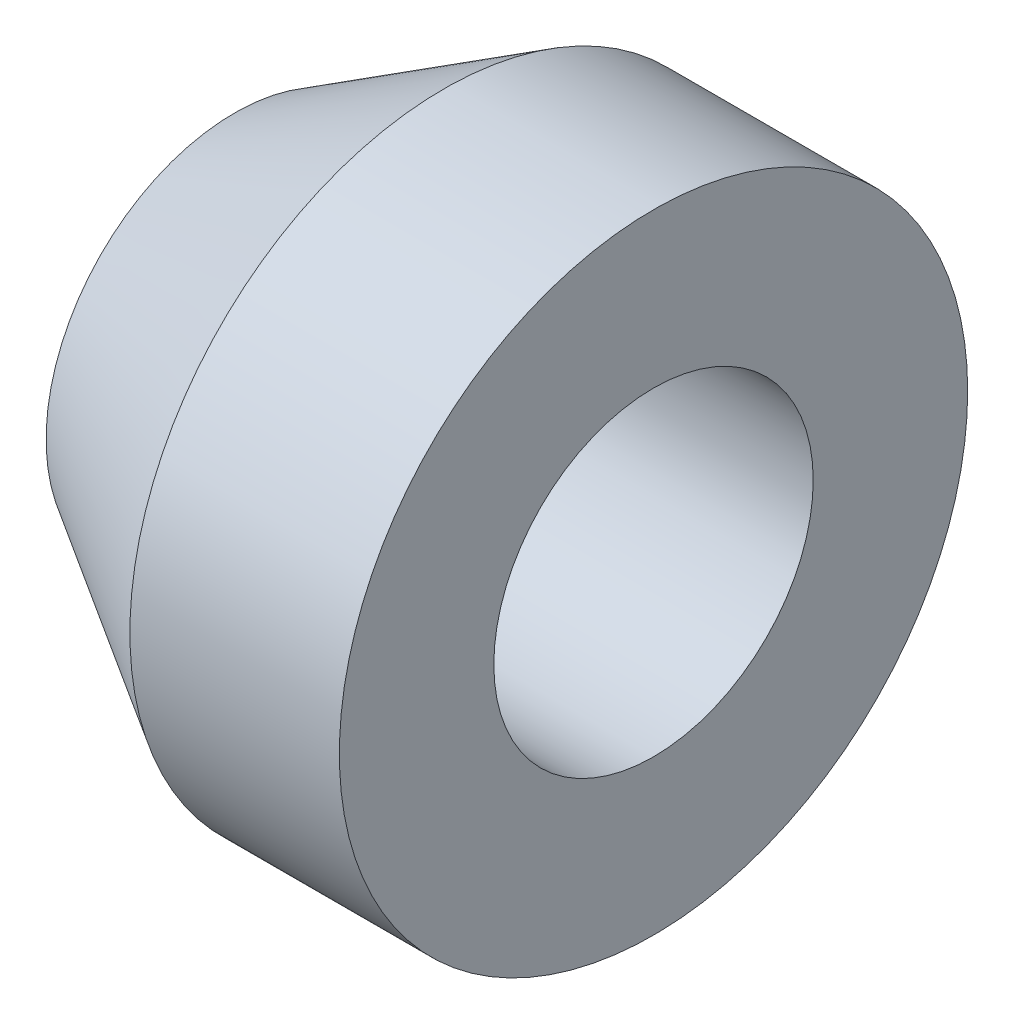
ISO-10303-21;
HEADER;
FILE_DESCRIPTION(('STEP AP214'),'2;1');
FILE_NAME('part.step','',(''),(''),'','','');
FILE_SCHEMA(('AUTOMOTIVE_DESIGN { 1 0 10303 214 1 1 1 1 }'));
ENDSEC;
DATA;
#1=APPLICATION_CONTEXT('core data for automotive mechanical design processes');
#2=APPLICATION_PROTOCOL_DEFINITION('international standard','automotive_design',2000,#1);
#3=PRODUCT_CONTEXT('',#1,'mechanical');
#4=PRODUCT('Part','Part','',(#3));
#5=PRODUCT_RELATED_PRODUCT_CATEGORY('part','',(#4));
#6=PRODUCT_DEFINITION_FORMATION('','',#4);
#7=PRODUCT_DEFINITION_CONTEXT('part definition',#1,'design');
#8=PRODUCT_DEFINITION('design','',#6,#7);
#9=PRODUCT_DEFINITION_SHAPE('','',#8);
#10=(LENGTH_UNIT() NAMED_UNIT(*) SI_UNIT(.MILLI.,.METRE.));
#11=(NAMED_UNIT(*) PLANE_ANGLE_UNIT() SI_UNIT($,.RADIAN.));
#12=(NAMED_UNIT(*) SI_UNIT($,.STERADIAN.) SOLID_ANGLE_UNIT());
#13=UNCERTAINTY_MEASURE_WITH_UNIT(LENGTH_MEASURE(1.E-05),#10,'distance_accuracy_value','');
#14=(GEOMETRIC_REPRESENTATION_CONTEXT(3) GLOBAL_UNCERTAINTY_ASSIGNED_CONTEXT((#13)) GLOBAL_UNIT_ASSIGNED_CONTEXT((#10,
#11,#12)) REPRESENTATION_CONTEXT('',''));
#15=CARTESIAN_POINT('',(0.,0.,0.));
#16=DIRECTION('',(0.,0.,1.));
#17=DIRECTION('',(1.,0.,0.));
#18=AXIS2_PLACEMENT_3D('',#15,#16,#17);
#19=CARTESIAN_POINT('',(4.,0.,0.));
#20=DIRECTION('',(1.,0.,0.));
#21=DIRECTION('',(0.,0.,-1.));
#22=AXIS2_PLACEMENT_3D('',#19,#20,#21);
#23=PLANE('',#22);
#24=CARTESIAN_POINT('',(4.,0.,0.));
#25=DIRECTION('',(1.,0.,0.));
#26=DIRECTION('',(0.,0.,-1.));
#27=AXIS2_PLACEMENT_3D('',#24,#25,#26);
#28=CIRCLE('',#27,3.);
#29=CARTESIAN_POINT('',(4.,0.,-3.));
#30=VERTEX_POINT('',#29);
#31=EDGE_CURVE('E41',#30,#30,#28,.T.);
#32=ORIENTED_EDGE('',*,*,#31,.T.);
#33=EDGE_LOOP('',(#32));
#34=FACE_BOUND('',#33,.T.);
#35=CARTESIAN_POINT('',(4.,0.,0.));
#36=DIRECTION('',(1.,0.,0.));
#37=DIRECTION('',(0.,0.,-1.));
#38=AXIS2_PLACEMENT_3D('',#35,#36,#37);
#39=CIRCLE('',#38,1.525);
#40=CARTESIAN_POINT('',(4.,0.,-1.525));
#41=VERTEX_POINT('',#40);
#42=EDGE_CURVE('E45',#41,#41,#39,.T.);
#43=ORIENTED_EDGE('',*,*,#42,.F.);
#44=EDGE_LOOP('',(#43));
#45=FACE_BOUND('',#44,.T.);
#46=ADVANCED_FACE('F30',(#34,#45),#23,.T.);
#47=CARTESIAN_POINT('',(0.,0.,0.));
#48=DIRECTION('',(1.,0.,0.));
#49=DIRECTION('',(0.,0.,-1.));
#50=AXIS2_PLACEMENT_3D('',#47,#48,#49);
#51=PLANE('',#50);
#52=CARTESIAN_POINT('',(0.,0.,0.));
#53=DIRECTION('',(1.,0.,0.));
#54=DIRECTION('',(0.,0.,-1.));
#55=AXIS2_PLACEMENT_3D('',#52,#53,#54);
#56=CIRCLE('',#55,1.8);
#57=CARTESIAN_POINT('',(0.,0.,-1.8));
#58=VERTEX_POINT('',#57);
#59=EDGE_CURVE('E10',#58,#58,#56,.F.);
#60=ORIENTED_EDGE('',*,*,#59,.T.);
#61=EDGE_LOOP('',(#60));
#62=FACE_BOUND('',#61,.T.);
#63=CARTESIAN_POINT('',(0.,0.,0.));
#64=DIRECTION('',(1.,0.,0.));
#65=DIRECTION('',(0.,0.,-1.));
#66=AXIS2_PLACEMENT_3D('',#63,#64,#65);
#67=CIRCLE('',#66,1.525);
#68=CARTESIAN_POINT('',(0.,0.,-1.525));
#69=VERTEX_POINT('',#68);
#70=EDGE_CURVE('E48',#69,#69,#67,.T.);
#71=ORIENTED_EDGE('',*,*,#70,.T.);
#72=EDGE_LOOP('',(#71));
#73=FACE_BOUND('',#72,.T.);
#74=ADVANCED_FACE('F58',(#62,#73),#51,.F.);
#75=CARTESIAN_POINT('',(4.,0.,0.));
#76=DIRECTION('',(-1.,0.,0.));
#77=DIRECTION('',(0.,0.,1.));
#78=AXIS2_PLACEMENT_3D('',#75,#76,#77);
#79=CYLINDRICAL_SURFACE('',#78,3.);
#80=CARTESIAN_POINT('',(2.00000000000001,0.,0.));
#81=DIRECTION('',(1.,0.,0.));
#82=DIRECTION('',(0.,0.,-1.));
#83=AXIS2_PLACEMENT_3D('',#80,#81,#82);
#84=CIRCLE('',#83,3.);
#85=CARTESIAN_POINT('',(2.00000000000001,0.,-3.));
#86=VERTEX_POINT('',#85);
#87=EDGE_CURVE('E37',#86,#86,#84,.T.);
#88=ORIENTED_EDGE('',*,*,#87,.T.);
#89=EDGE_LOOP('',(#88));
#90=FACE_BOUND('',#89,.T.);
#91=ORIENTED_EDGE('',*,*,#31,.F.);
#92=EDGE_LOOP('',(#91));
#93=FACE_BOUND('',#92,.T.);
#94=ADVANCED_FACE('F64',(#90,#93),#79,.T.);
#95=CARTESIAN_POINT('',(4.,0.,0.));
#96=DIRECTION('',(-1.,0.,0.));
#97=DIRECTION('',(0.,0.,1.));
#98=AXIS2_PLACEMENT_3D('',#95,#96,#97);
#99=CYLINDRICAL_SURFACE('',#98,1.525);
#100=ORIENTED_EDGE('',*,*,#42,.T.);
#101=EDGE_LOOP('',(#100));
#102=FACE_BOUND('',#101,.T.);
#103=ORIENTED_EDGE('',*,*,#70,.F.);
#104=EDGE_LOOP('',(#103));
#105=FACE_BOUND('',#104,.T.);
#106=ADVANCED_FACE('F54',(#102,#105),#99,.F.);
#107=CARTESIAN_POINT('',(2.00000000000001,0.,0.));
#108=DIRECTION('',(1.,0.,0.));
#109=DIRECTION('',(0.,0.,-1.));
#110=AXIS2_PLACEMENT_3D('',#107,#108,#109);
#111=CONICAL_SURFACE('',#110,3.,0.540419500270582);
#112=ORIENTED_EDGE('',*,*,#59,.F.);
#113=EDGE_LOOP('',(#112));
#114=FACE_BOUND('',#113,.T.);
#115=ORIENTED_EDGE('',*,*,#87,.F.);
#116=EDGE_LOOP('',(#115));
#117=FACE_BOUND('',#116,.T.);
#118=ADVANCED_FACE('F32',(#114,#117),#111,.T.);
#119=CLOSED_SHELL('',(#46,#74,#94,#106,#118));
#120=MANIFOLD_SOLID_BREP('B2',#119);
#121=ADVANCED_BREP_SHAPE_REPRESENTATION('',(#18,#120),#14);
#122=SHAPE_DEFINITION_REPRESENTATION(#9,#121);
ENDSEC;
END-ISO-10303-21;
